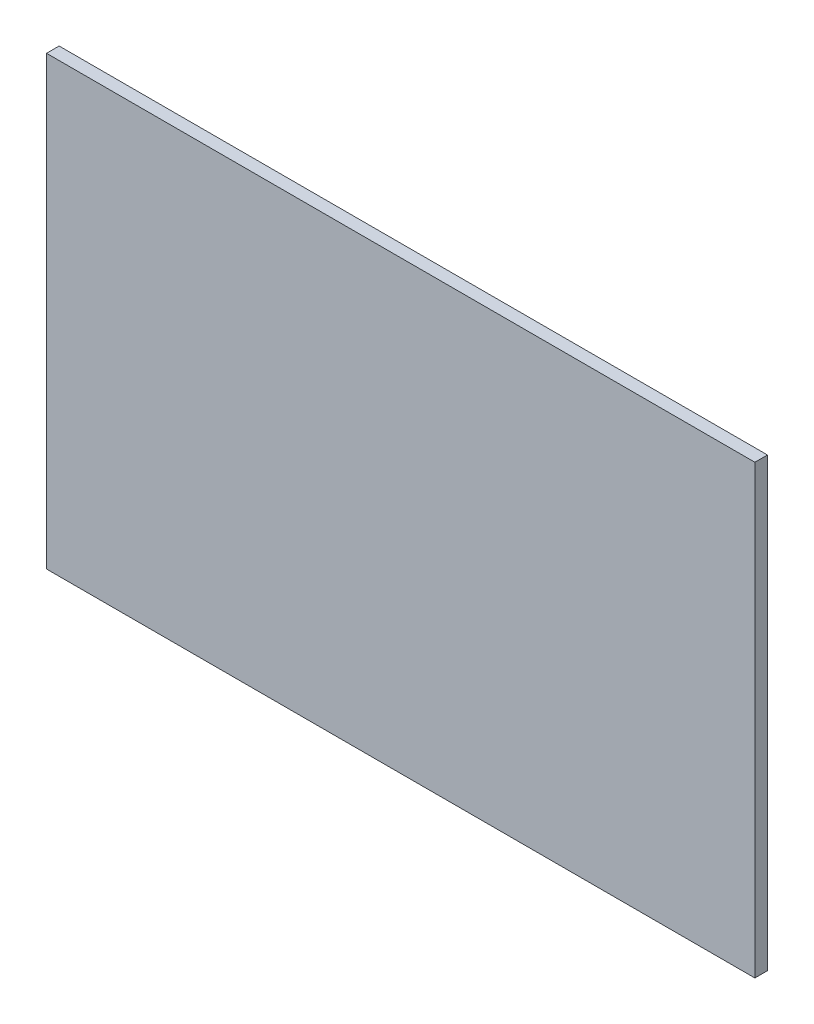
ISO-10303-21;
HEADER;
FILE_DESCRIPTION(('STEP AP214'),'2;1');
FILE_NAME('part.step','',(''),(''),'','','');
FILE_SCHEMA(('AUTOMOTIVE_DESIGN { 1 0 10303 214 1 1 1 1 }'));
ENDSEC;
DATA;
#1=APPLICATION_CONTEXT('core data for automotive mechanical design processes');
#2=APPLICATION_PROTOCOL_DEFINITION('international standard','automotive_design',2000,#1);
#3=PRODUCT_CONTEXT('',#1,'mechanical');
#4=PRODUCT('Part','Part','',(#3));
#5=PRODUCT_RELATED_PRODUCT_CATEGORY('part','',(#4));
#6=PRODUCT_DEFINITION_FORMATION('','',#4);
#7=PRODUCT_DEFINITION_CONTEXT('part definition',#1,'design');
#8=PRODUCT_DEFINITION('design','',#6,#7);
#9=PRODUCT_DEFINITION_SHAPE('','',#8);
#10=(LENGTH_UNIT() NAMED_UNIT(*) SI_UNIT(.MILLI.,.METRE.));
#11=(NAMED_UNIT(*) PLANE_ANGLE_UNIT() SI_UNIT($,.RADIAN.));
#12=(NAMED_UNIT(*) SI_UNIT($,.STERADIAN.) SOLID_ANGLE_UNIT());
#13=UNCERTAINTY_MEASURE_WITH_UNIT(LENGTH_MEASURE(1.E-05),#10,'distance_accuracy_value','');
#14=(GEOMETRIC_REPRESENTATION_CONTEXT(3) GLOBAL_UNCERTAINTY_ASSIGNED_CONTEXT((#13)) GLOBAL_UNIT_ASSIGNED_CONTEXT((#10,
#11,#12)) REPRESENTATION_CONTEXT('',''));
#15=CARTESIAN_POINT('',(0.,0.,0.));
#16=DIRECTION('',(0.,0.,1.));
#17=DIRECTION('',(1.,0.,0.));
#18=AXIS2_PLACEMENT_3D('',#15,#16,#17);
#19=CARTESIAN_POINT('',(-67.4,42.5,2.4));
#20=DIRECTION('',(1.,0.,0.));
#21=DIRECTION('',(0.,0.,-1.));
#22=AXIS2_PLACEMENT_3D('',#19,#20,#21);
#23=PLANE('',#22);
#24=DIRECTION('',(0.,-1.,0.));
#25=VECTOR('',#24,1.);
#26=CARTESIAN_POINT('',(-67.4,42.5,0.));
#27=LINE('',#26,#25);
#28=CARTESIAN_POINT('',(-67.4,42.5,0.));
#29=VERTEX_POINT('',#28);
#30=CARTESIAN_POINT('',(-67.4,-42.5,0.));
#31=VERTEX_POINT('',#30);
#32=EDGE_CURVE('E96',#29,#31,#27,.T.);
#33=ORIENTED_EDGE('',*,*,#32,.T.);
#34=DIRECTION('',(0.,0.,-1.));
#35=VECTOR('',#34,1.);
#36=CARTESIAN_POINT('',(-67.4,-42.5,2.4));
#37=LINE('',#36,#35);
#38=CARTESIAN_POINT('',(-67.4,-42.5,2.4));
#39=VERTEX_POINT('',#38);
#40=EDGE_CURVE('E11',#39,#31,#37,.T.);
#41=ORIENTED_EDGE('',*,*,#40,.F.);
#42=DIRECTION('',(0.,-1.,0.));
#43=VECTOR('',#42,1.);
#44=CARTESIAN_POINT('',(-67.4,42.5,2.4));
#45=LINE('',#44,#43);
#46=CARTESIAN_POINT('',(-67.4,42.5,2.4));
#47=VERTEX_POINT('',#46);
#48=EDGE_CURVE('E84',#47,#39,#45,.T.);
#49=ORIENTED_EDGE('',*,*,#48,.F.);
#50=DIRECTION('',(0.,0.,-1.));
#51=VECTOR('',#50,1.);
#52=CARTESIAN_POINT('',(-67.4,42.5,2.4));
#53=LINE('',#52,#51);
#54=EDGE_CURVE('E92',#47,#29,#53,.T.);
#55=ORIENTED_EDGE('',*,*,#54,.T.);
#56=EDGE_LOOP('',(#33,#41,#49,#55));
#57=FACE_BOUND('',#56,.T.);
#58=ADVANCED_FACE('F33',(#57),#23,.F.);
#59=CARTESIAN_POINT('',(67.4,-42.5,2.4));
#60=DIRECTION('',(0.,1.,0.));
#61=DIRECTION('',(-1.,0.,0.));
#62=AXIS2_PLACEMENT_3D('',#59,#60,#61);
#63=PLANE('',#62);
#64=DIRECTION('',(1.,0.,0.));
#65=VECTOR('',#64,1.);
#66=CARTESIAN_POINT('',(67.4,-42.5,0.));
#67=LINE('',#66,#65);
#68=CARTESIAN_POINT('',(67.4,-42.5,0.));
#69=VERTEX_POINT('',#68);
#70=EDGE_CURVE('E88',#31,#69,#67,.T.);
#71=ORIENTED_EDGE('',*,*,#70,.T.);
#72=DIRECTION('',(0.,0.,-1.));
#73=VECTOR('',#72,1.);
#74=CARTESIAN_POINT('',(67.4,-42.5,2.4));
#75=LINE('',#74,#73);
#76=CARTESIAN_POINT('',(67.4,-42.5,2.4));
#77=VERTEX_POINT('',#76);
#78=EDGE_CURVE('E41',#77,#69,#75,.T.);
#79=ORIENTED_EDGE('',*,*,#78,.F.);
#80=DIRECTION('',(1.,0.,0.));
#81=VECTOR('',#80,1.);
#82=CARTESIAN_POINT('',(67.4,-42.5,2.4));
#83=LINE('',#82,#81);
#84=EDGE_CURVE('E79',#39,#77,#83,.T.);
#85=ORIENTED_EDGE('',*,*,#84,.F.);
#86=ORIENTED_EDGE('',*,*,#40,.T.);
#87=EDGE_LOOP('',(#71,#79,#85,#86));
#88=FACE_BOUND('',#87,.T.);
#89=ADVANCED_FACE('F87',(#88),#63,.F.);
#90=CARTESIAN_POINT('',(67.4,42.5,2.4));
#91=DIRECTION('',(-1.,0.,0.));
#92=DIRECTION('',(0.,-1.,0.));
#93=AXIS2_PLACEMENT_3D('',#90,#91,#92);
#94=PLANE('',#93);
#95=DIRECTION('',(0.,1.,0.));
#96=VECTOR('',#95,1.);
#97=CARTESIAN_POINT('',(67.4,42.5,0.));
#98=LINE('',#97,#96);
#99=CARTESIAN_POINT('',(67.4,42.5,0.));
#100=VERTEX_POINT('',#99);
#101=EDGE_CURVE('E66',#69,#100,#98,.T.);
#102=ORIENTED_EDGE('',*,*,#101,.T.);
#103=DIRECTION('',(0.,0.,-1.));
#104=VECTOR('',#103,1.);
#105=CARTESIAN_POINT('',(67.4,42.5,2.4));
#106=LINE('',#105,#104);
#107=CARTESIAN_POINT('',(67.4,42.5,2.4));
#108=VERTEX_POINT('',#107);
#109=EDGE_CURVE('E89',#108,#100,#106,.T.);
#110=ORIENTED_EDGE('',*,*,#109,.F.);
#111=DIRECTION('',(0.,1.,0.));
#112=VECTOR('',#111,1.);
#113=CARTESIAN_POINT('',(67.4,42.5,2.4));
#114=LINE('',#113,#112);
#115=EDGE_CURVE('E82',#77,#108,#114,.T.);
#116=ORIENTED_EDGE('',*,*,#115,.F.);
#117=ORIENTED_EDGE('',*,*,#78,.T.);
#118=EDGE_LOOP('',(#102,#110,#116,#117));
#119=FACE_BOUND('',#118,.T.);
#120=ADVANCED_FACE('F90',(#119),#94,.F.);
#121=CARTESIAN_POINT('',(67.4,42.5,2.4));
#122=DIRECTION('',(0.,-1.,0.));
#123=DIRECTION('',(1.,0.,0.));
#124=AXIS2_PLACEMENT_3D('',#121,#122,#123);
#125=PLANE('',#124);
#126=DIRECTION('',(-1.,0.,0.));
#127=VECTOR('',#126,1.);
#128=CARTESIAN_POINT('',(67.4,42.5,0.));
#129=LINE('',#128,#127);
#130=EDGE_CURVE('E72',#100,#29,#129,.T.);
#131=ORIENTED_EDGE('',*,*,#130,.T.);
#132=ORIENTED_EDGE('',*,*,#54,.F.);
#133=DIRECTION('',(-1.,0.,0.));
#134=VECTOR('',#133,1.);
#135=CARTESIAN_POINT('',(67.4,42.5,2.4));
#136=LINE('',#135,#134);
#137=EDGE_CURVE('E49',#108,#47,#136,.T.);
#138=ORIENTED_EDGE('',*,*,#137,.F.);
#139=ORIENTED_EDGE('',*,*,#109,.T.);
#140=EDGE_LOOP('',(#131,#132,#138,#139));
#141=FACE_BOUND('',#140,.T.);
#142=ADVANCED_FACE('F103',(#141),#125,.F.);
#143=CARTESIAN_POINT('',(0.,0.,2.4));
#144=DIRECTION('',(0.,0.,-1.));
#145=DIRECTION('',(-1.,0.,0.));
#146=AXIS2_PLACEMENT_3D('',#143,#144,#145);
#147=PLANE('',#146);
#148=ORIENTED_EDGE('',*,*,#48,.T.);
#149=ORIENTED_EDGE('',*,*,#84,.T.);
#150=ORIENTED_EDGE('',*,*,#115,.T.);
#151=ORIENTED_EDGE('',*,*,#137,.T.);
#152=EDGE_LOOP('',(#148,#149,#150,#151));
#153=FACE_BOUND('',#152,.T.);
#154=ADVANCED_FACE('F80',(#153),#147,.F.);
#155=CARTESIAN_POINT('',(0.,0.,0.));
#156=DIRECTION('',(0.,0.,-1.));
#157=DIRECTION('',(-1.,0.,0.));
#158=AXIS2_PLACEMENT_3D('',#155,#156,#157);
#159=PLANE('',#158);
#160=ORIENTED_EDGE('',*,*,#32,.F.);
#161=ORIENTED_EDGE('',*,*,#130,.F.);
#162=ORIENTED_EDGE('',*,*,#101,.F.);
#163=ORIENTED_EDGE('',*,*,#70,.F.);
#164=EDGE_LOOP('',(#160,#161,#162,#163));
#165=FACE_BOUND('',#164,.T.);
#166=ADVANCED_FACE('F106',(#165),#159,.T.);
#167=CLOSED_SHELL('',(#58,#89,#120,#142,#154,#166));
#168=MANIFOLD_SOLID_BREP('B2',#167);
#169=ADVANCED_BREP_SHAPE_REPRESENTATION('',(#18,#168),#14);
#170=SHAPE_DEFINITION_REPRESENTATION(#9,#169);
ENDSEC;
END-ISO-10303-21;
